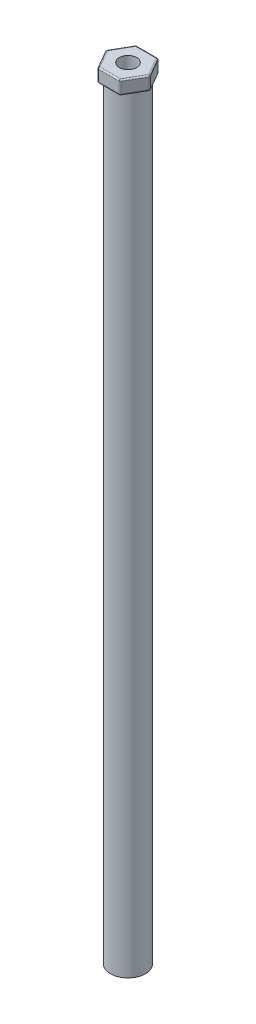
ISO-10303-21;
HEADER;
FILE_DESCRIPTION(('STEP AP214'),'2;1');
FILE_NAME('part.step','',(''),(''),'','','');
FILE_SCHEMA(('AUTOMOTIVE_DESIGN { 1 0 10303 214 1 1 1 1 }'));
ENDSEC;
DATA;
#1=APPLICATION_CONTEXT('core data for automotive mechanical design processes');
#2=APPLICATION_PROTOCOL_DEFINITION('international standard','automotive_design',2000,#1);
#3=PRODUCT_CONTEXT('',#1,'mechanical');
#4=PRODUCT('Part','Part','',(#3));
#5=PRODUCT_RELATED_PRODUCT_CATEGORY('part','',(#4));
#6=PRODUCT_DEFINITION_FORMATION('','',#4);
#7=PRODUCT_DEFINITION_CONTEXT('part definition',#1,'design');
#8=PRODUCT_DEFINITION('design','',#6,#7);
#9=PRODUCT_DEFINITION_SHAPE('','',#8);
#10=(LENGTH_UNIT() NAMED_UNIT(*) SI_UNIT(.MILLI.,.METRE.));
#11=(NAMED_UNIT(*) PLANE_ANGLE_UNIT() SI_UNIT($,.RADIAN.));
#12=(NAMED_UNIT(*) SI_UNIT($,.STERADIAN.) SOLID_ANGLE_UNIT());
#13=UNCERTAINTY_MEASURE_WITH_UNIT(LENGTH_MEASURE(1.E-05),#10,'distance_accuracy_value','');
#14=(GEOMETRIC_REPRESENTATION_CONTEXT(3) GLOBAL_UNCERTAINTY_ASSIGNED_CONTEXT((#13)) GLOBAL_UNIT_ASSIGNED_CONTEXT((#10,
#11,#12)) REPRESENTATION_CONTEXT('',''));
#15=CARTESIAN_POINT('',(0.,0.,0.));
#16=DIRECTION('',(0.,0.,1.));
#17=DIRECTION('',(1.,0.,0.));
#18=AXIS2_PLACEMENT_3D('',#15,#16,#17);
#19=CARTESIAN_POINT('',(0.,0.,0.));
#20=DIRECTION('',(0.,1.,0.));
#21=DIRECTION('',(0.,0.,1.));
#22=AXIS2_PLACEMENT_3D('',#19,#20,#21);
#23=PLANE('',#22);
#24=CARTESIAN_POINT('',(0.,0.,0.));
#25=DIRECTION('',(0.,1.,0.));
#26=DIRECTION('',(0.,0.,1.));
#27=AXIS2_PLACEMENT_3D('',#24,#25,#26);
#28=CIRCLE('',#27,6.35);
#29=CARTESIAN_POINT('',(0.,0.,6.35));
#30=VERTEX_POINT('',#29);
#31=EDGE_CURVE('E328',#30,#30,#28,.T.);
#32=ORIENTED_EDGE('',*,*,#31,.F.);
#33=EDGE_LOOP('',(#32));
#34=FACE_BOUND('',#33,.T.);
#35=CARTESIAN_POINT('',(0.,0.,0.));
#36=DIRECTION('',(0.,1.,0.));
#37=DIRECTION('',(0.,0.,1.));
#38=AXIS2_PLACEMENT_3D('',#35,#36,#37);
#39=CIRCLE('',#38,3.175);
#40=CARTESIAN_POINT('',(0.,0.,3.175));
#41=VERTEX_POINT('',#40);
#42=EDGE_CURVE('E322',#41,#41,#39,.T.);
#43=ORIENTED_EDGE('',*,*,#42,.T.);
#44=EDGE_LOOP('',(#43));
#45=FACE_BOUND('',#44,.T.);
#46=ADVANCED_FACE('F43',(#34,#45),#23,.F.);
#47=CARTESIAN_POINT('',(0.,279.4,0.));
#48=DIRECTION('',(0.,-1.,0.));
#49=DIRECTION('',(0.,0.,-1.));
#50=AXIS2_PLACEMENT_3D('',#47,#48,#49);
#51=CYLINDRICAL_SURFACE('',#50,6.35);
#52=CARTESIAN_POINT('',(0.,279.4,0.));
#53=DIRECTION('',(0.,1.,0.));
#54=DIRECTION('',(0.,0.,1.));
#55=AXIS2_PLACEMENT_3D('',#52,#53,#54);
#56=CIRCLE('',#55,6.35);
#57=CARTESIAN_POINT('',(0.,279.4,6.35));
#58=VERTEX_POINT('',#57);
#59=EDGE_CURVE('E192',#58,#58,#56,.T.);
#60=ORIENTED_EDGE('',*,*,#59,.F.);
#61=EDGE_LOOP('',(#60));
#62=FACE_BOUND('',#61,.T.);
#63=ORIENTED_EDGE('',*,*,#31,.T.);
#64=EDGE_LOOP('',(#63));
#65=FACE_BOUND('',#64,.T.);
#66=ADVANCED_FACE('F525',(#62,#65),#51,.T.);
#67=CARTESIAN_POINT('',(0.,279.4,0.));
#68=DIRECTION('',(0.,-1.,0.));
#69=DIRECTION('',(0.,0.,-1.));
#70=AXIS2_PLACEMENT_3D('',#67,#68,#69);
#71=CYLINDRICAL_SURFACE('',#70,3.175);
#72=ORIENTED_EDGE('',*,*,#42,.F.);
#73=EDGE_LOOP('',(#72));
#74=FACE_BOUND('',#73,.T.);
#75=CARTESIAN_POINT('',(0.,284.4,0.));
#76=DIRECTION('',(0.,1.,0.));
#77=DIRECTION('',(0.,0.,1.));
#78=AXIS2_PLACEMENT_3D('',#75,#76,#77);
#79=CIRCLE('',#78,3.175);
#80=CARTESIAN_POINT('',(0.,284.4,3.175));
#81=VERTEX_POINT('',#80);
#82=EDGE_CURVE('E315',#81,#81,#79,.T.);
#83=ORIENTED_EDGE('',*,*,#82,.T.);
#84=EDGE_LOOP('',(#83));
#85=FACE_BOUND('',#84,.T.);
#86=ADVANCED_FACE('F531',(#74,#85),#71,.F.);
#87=CARTESIAN_POINT('',(0.,284.4,0.));
#88=DIRECTION('',(0.,1.,0.));
#89=DIRECTION('',(0.,0.,1.));
#90=AXIS2_PLACEMENT_3D('',#87,#88,#89);
#91=PLANE('',#90);
#92=DIRECTION('',(1.,0.,0.));
#93=VECTOR('',#92,1.);
#94=CARTESIAN_POINT('',(4.03279163028954,284.4,6.485));
#95=LINE('',#94,#93);
#96=CARTESIAN_POINT('',(-3.74411649569472,284.4,6.485));
#97=VERTEX_POINT('',#96);
#98=CARTESIAN_POINT('',(3.74411649569473,284.4,6.485));
#99=VERTEX_POINT('',#98);
#100=EDGE_CURVE('E423',#97,#99,#95,.T.);
#101=ORIENTED_EDGE('',*,*,#100,.T.);
#102=DIRECTION('',(0.5,0.,-0.866025403784439));
#103=VECTOR('',#102,1.);
#104=CARTESIAN_POINT('',(7.63257055868686,284.4,-0.250000000000001));
#105=LINE('',#104,#103);
#106=CARTESIAN_POINT('',(7.48823299138945,284.4,0.));
#107=VERTEX_POINT('',#106);
#108=EDGE_CURVE('E11',#99,#107,#105,.T.);
#109=ORIENTED_EDGE('',*,*,#108,.T.);
#110=DIRECTION('',(-0.5,0.,-0.866025403784439));
#111=VECTOR('',#110,1.);
#112=CARTESIAN_POINT('',(3.59977892839731,284.4,-6.73500000000001));
#113=LINE('',#112,#111);
#114=CARTESIAN_POINT('',(3.74411649569472,284.4,-6.485));
#115=VERTEX_POINT('',#114);
#116=EDGE_CURVE('E53',#107,#115,#113,.T.);
#117=ORIENTED_EDGE('',*,*,#116,.T.);
#118=DIRECTION('',(-1.,0.,0.));
#119=VECTOR('',#118,1.);
#120=CARTESIAN_POINT('',(-4.03279163028953,284.4,-6.485));
#121=LINE('',#120,#119);
#122=CARTESIAN_POINT('',(-3.74411649569472,284.4,-6.485));
#123=VERTEX_POINT('',#122);
#124=EDGE_CURVE('E432',#115,#123,#121,.T.);
#125=ORIENTED_EDGE('',*,*,#124,.T.);
#126=DIRECTION('',(-0.5,0.,0.866025403784439));
#127=VECTOR('',#126,1.);
#128=CARTESIAN_POINT('',(-7.63257055868686,284.4,0.250000000000005));
#129=LINE('',#128,#127);
#130=CARTESIAN_POINT('',(-7.48823299138945,284.4,0.));
#131=VERTEX_POINT('',#130);
#132=EDGE_CURVE('E429',#123,#131,#129,.T.);
#133=ORIENTED_EDGE('',*,*,#132,.T.);
#134=DIRECTION('',(0.5,0.,0.866025403784438));
#135=VECTOR('',#134,1.);
#136=CARTESIAN_POINT('',(-3.59977892839732,284.4,6.735));
#137=LINE('',#136,#135);
#138=EDGE_CURVE('E426',#131,#97,#137,.T.);
#139=ORIENTED_EDGE('',*,*,#138,.T.);
#140=EDGE_LOOP('',(#101,#109,#117,#125,#133,#139));
#141=FACE_BOUND('',#140,.T.);
#142=ORIENTED_EDGE('',*,*,#82,.F.);
#143=EDGE_LOOP('',(#142));
#144=FACE_BOUND('',#143,.T.);
#145=ADVANCED_FACE('F490',(#141,#144),#91,.T.);
#146=CARTESIAN_POINT('',(0.,279.4,0.));
#147=DIRECTION('',(0.,1.,0.));
#148=DIRECTION('',(0.,0.,1.));
#149=AXIS2_PLACEMENT_3D('',#146,#147,#148);
#150=PLANE('',#149);
#151=DIRECTION('',(-0.5,0.,0.866025403784439));
#152=VECTOR('',#151,1.);
#153=CARTESIAN_POINT('',(-5.61617474354209,279.4,-3.2425));
#154=LINE('',#153,#152);
#155=CARTESIAN_POINT('',(-7.48823299138945,279.4,0.));
#156=VERTEX_POINT('',#155);
#157=CARTESIAN_POINT('',(-3.74411649569472,279.4,-6.485));
#158=VERTEX_POINT('',#157);
#159=EDGE_CURVE('E350',#156,#158,#154,.F.);
#160=ORIENTED_EDGE('',*,*,#159,.T.);
#161=DIRECTION('',(-1.,0.,0.));
#162=VECTOR('',#161,1.);
#163=CARTESIAN_POINT('',(0.,279.4,-6.485));
#164=LINE('',#163,#162);
#165=CARTESIAN_POINT('',(3.74411649569472,279.4,-6.485));
#166=VERTEX_POINT('',#165);
#167=EDGE_CURVE('E356',#158,#166,#164,.F.);
#168=ORIENTED_EDGE('',*,*,#167,.T.);
#169=DIRECTION('',(-0.5,0.,-0.866025403784439));
#170=VECTOR('',#169,1.);
#171=CARTESIAN_POINT('',(5.61617474354209,279.4,-3.2425));
#172=LINE('',#171,#170);
#173=CARTESIAN_POINT('',(7.48823299138945,279.4,0.));
#174=VERTEX_POINT('',#173);
#175=EDGE_CURVE('E353',#166,#174,#172,.F.);
#176=ORIENTED_EDGE('',*,*,#175,.T.);
#177=DIRECTION('',(0.5,0.,-0.866025403784439));
#178=VECTOR('',#177,1.);
#179=CARTESIAN_POINT('',(5.61617474354209,279.4,3.2425));
#180=LINE('',#179,#178);
#181=CARTESIAN_POINT('',(3.74411649569472,279.4,6.485));
#182=VERTEX_POINT('',#181);
#183=EDGE_CURVE('E341',#174,#182,#180,.F.);
#184=ORIENTED_EDGE('',*,*,#183,.T.);
#185=DIRECTION('',(1.,0.,0.));
#186=VECTOR('',#185,1.);
#187=CARTESIAN_POINT('',(0.,279.4,6.485));
#188=LINE('',#187,#186);
#189=CARTESIAN_POINT('',(-3.74411649569472,279.4,6.485));
#190=VERTEX_POINT('',#189);
#191=EDGE_CURVE('E344',#182,#190,#188,.F.);
#192=ORIENTED_EDGE('',*,*,#191,.T.);
#193=DIRECTION('',(0.5,0.,0.866025403784438));
#194=VECTOR('',#193,1.);
#195=CARTESIAN_POINT('',(-5.61617474354208,279.4,3.2425));
#196=LINE('',#195,#194);
#197=EDGE_CURVE('E347',#190,#156,#196,.F.);
#198=ORIENTED_EDGE('',*,*,#197,.T.);
#199=EDGE_LOOP('',(#160,#168,#176,#184,#192,#198));
#200=FACE_BOUND('',#199,.T.);
#201=ORIENTED_EDGE('',*,*,#59,.T.);
#202=EDGE_LOOP('',(#201));
#203=FACE_BOUND('',#202,.T.);
#204=ADVANCED_FACE('F468',(#200,#203),#150,.F.);
#205=CARTESIAN_POINT('',(-4.03279163028953,284.4,-6.985));
#206=DIRECTION('',(0.866025403784439,0.,0.5));
#207=DIRECTION('',(0.5,0.,-0.866025403784439));
#208=AXIS2_PLACEMENT_3D('',#205,#206,#207);
#209=PLANE('',#208);
#210=DIRECTION('',(-0.5,0.,0.866025403784439));
#211=VECTOR('',#210,1.);
#212=CARTESIAN_POINT('',(-4.03279163028953,283.9,-6.985));
#213=LINE('',#212,#211);
#214=CARTESIAN_POINT('',(-7.92124569328167,283.9,-0.249999999999997));
#215=VERTEX_POINT('',#214);
#216=CARTESIAN_POINT('',(-4.17712919758694,283.9,-6.735));
#217=VERTEX_POINT('',#216);
#218=EDGE_CURVE('E386',#215,#217,#213,.F.);
#219=ORIENTED_EDGE('',*,*,#218,.T.);
#220=DIRECTION('',(0.,-1.,0.));
#221=VECTOR('',#220,1.);
#222=CARTESIAN_POINT('',(-4.17712919758694,284.4,-6.735));
#223=LINE('',#222,#221);
#224=CARTESIAN_POINT('',(-4.17712919758694,279.9,-6.735));
#225=VERTEX_POINT('',#224);
#226=EDGE_CURVE('E205',#217,#225,#223,.T.);
#227=ORIENTED_EDGE('',*,*,#226,.T.);
#228=DIRECTION('',(-0.5,0.,0.866025403784439));
#229=VECTOR('',#228,1.);
#230=CARTESIAN_POINT('',(-4.03279163028953,279.9,-6.985));
#231=LINE('',#230,#229);
#232=CARTESIAN_POINT('',(-7.92124569328167,279.9,-0.249999999999997));
#233=VERTEX_POINT('',#232);
#234=EDGE_CURVE('E392',#225,#233,#231,.T.);
#235=ORIENTED_EDGE('',*,*,#234,.T.);
#236=DIRECTION('',(0.,-1.,0.));
#237=VECTOR('',#236,1.);
#238=CARTESIAN_POINT('',(-7.92124569328167,284.4,-0.249999999999998));
#239=LINE('',#238,#237);
#240=EDGE_CURVE('E389',#233,#215,#239,.F.);
#241=ORIENTED_EDGE('',*,*,#240,.T.);
#242=EDGE_LOOP('',(#219,#227,#235,#241));
#243=FACE_BOUND('',#242,.T.);
#244=ADVANCED_FACE('F483',(#243),#209,.F.);
#245=CARTESIAN_POINT('',(-8.06558326057907,284.4,0.));
#246=DIRECTION('',(0.866025403784438,0.,-0.5));
#247=DIRECTION('',(-0.5,0.,-0.866025403784438));
#248=AXIS2_PLACEMENT_3D('',#245,#246,#247);
#249=PLANE('',#248);
#250=DIRECTION('',(0.5,0.,0.866025403784438));
#251=VECTOR('',#250,1.);
#252=CARTESIAN_POINT('',(-8.06558326057907,283.9,0.));
#253=LINE('',#252,#251);
#254=CARTESIAN_POINT('',(-4.17712919758694,283.9,6.735));
#255=VERTEX_POINT('',#254);
#256=CARTESIAN_POINT('',(-7.92124569328167,283.9,0.250000000000003));
#257=VERTEX_POINT('',#256);
#258=EDGE_CURVE('E397',#255,#257,#253,.F.);
#259=ORIENTED_EDGE('',*,*,#258,.T.);
#260=DIRECTION('',(0.,-1.,0.));
#261=VECTOR('',#260,1.);
#262=CARTESIAN_POINT('',(-7.92124569328167,284.4,0.250000000000003));
#263=LINE('',#262,#261);
#264=CARTESIAN_POINT('',(-7.92124569328167,279.9,0.250000000000003));
#265=VERTEX_POINT('',#264);
#266=EDGE_CURVE('E406',#257,#265,#263,.T.);
#267=ORIENTED_EDGE('',*,*,#266,.T.);
#268=DIRECTION('',(0.5,0.,0.866025403784438));
#269=VECTOR('',#268,1.);
#270=CARTESIAN_POINT('',(-8.06558326057907,279.9,0.));
#271=LINE('',#270,#269);
#272=CARTESIAN_POINT('',(-4.17712919758694,279.9,6.735));
#273=VERTEX_POINT('',#272);
#274=EDGE_CURVE('E403',#265,#273,#271,.T.);
#275=ORIENTED_EDGE('',*,*,#274,.T.);
#276=DIRECTION('',(0.,-1.,0.));
#277=VECTOR('',#276,1.);
#278=CARTESIAN_POINT('',(-4.17712919758694,284.4,6.735));
#279=LINE('',#278,#277);
#280=EDGE_CURVE('E400',#273,#255,#279,.F.);
#281=ORIENTED_EDGE('',*,*,#280,.T.);
#282=EDGE_LOOP('',(#259,#267,#275,#281));
#283=FACE_BOUND('',#282,.T.);
#284=ADVANCED_FACE('F506',(#283),#249,.F.);
#285=CARTESIAN_POINT('',(-4.03279163028953,284.4,6.985));
#286=DIRECTION('',(0.,0.,-1.));
#287=DIRECTION('',(-1.,0.,0.));
#288=AXIS2_PLACEMENT_3D('',#285,#286,#287);
#289=PLANE('',#288);
#290=DIRECTION('',(1.,0.,0.));
#291=VECTOR('',#290,1.);
#292=CARTESIAN_POINT('',(-4.03279163028953,283.9,6.985));
#293=LINE('',#292,#291);
#294=CARTESIAN_POINT('',(3.74411649569472,283.9,6.985));
#295=VERTEX_POINT('',#294);
#296=CARTESIAN_POINT('',(-3.74411649569472,283.9,6.985));
#297=VERTEX_POINT('',#296);
#298=EDGE_CURVE('E410',#295,#297,#293,.F.);
#299=ORIENTED_EDGE('',*,*,#298,.T.);
#300=DIRECTION('',(0.,-1.,0.));
#301=VECTOR('',#300,1.);
#302=CARTESIAN_POINT('',(-3.74411649569472,284.4,6.985));
#303=LINE('',#302,#301);
#304=CARTESIAN_POINT('',(-3.74411649569472,279.9,6.985));
#305=VERTEX_POINT('',#304);
#306=EDGE_CURVE('E419',#297,#305,#303,.T.);
#307=ORIENTED_EDGE('',*,*,#306,.T.);
#308=DIRECTION('',(1.,0.,0.));
#309=VECTOR('',#308,1.);
#310=CARTESIAN_POINT('',(-4.03279163028953,279.9,6.985));
#311=LINE('',#310,#309);
#312=CARTESIAN_POINT('',(3.74411649569472,279.9,6.985));
#313=VERTEX_POINT('',#312);
#314=EDGE_CURVE('E416',#305,#313,#311,.T.);
#315=ORIENTED_EDGE('',*,*,#314,.T.);
#316=DIRECTION('',(0.,-1.,0.));
#317=VECTOR('',#316,1.);
#318=CARTESIAN_POINT('',(3.74411649569472,284.4,6.985));
#319=LINE('',#318,#317);
#320=EDGE_CURVE('E413',#313,#295,#319,.F.);
#321=ORIENTED_EDGE('',*,*,#320,.T.);
#322=EDGE_LOOP('',(#299,#307,#315,#321));
#323=FACE_BOUND('',#322,.T.);
#324=ADVANCED_FACE('F637',(#323),#289,.F.);
#325=CARTESIAN_POINT('',(4.03279163028954,284.4,6.985));
#326=DIRECTION('',(-0.866025403784439,0.,-0.5));
#327=DIRECTION('',(-0.5,0.,0.866025403784439));
#328=AXIS2_PLACEMENT_3D('',#325,#326,#327);
#329=PLANE('',#328);
#330=DIRECTION('',(0.5,0.,-0.866025403784439));
#331=VECTOR('',#330,1.);
#332=CARTESIAN_POINT('',(4.03279163028954,279.9,6.985));
#333=LINE('',#332,#331);
#334=CARTESIAN_POINT('',(4.17712919758694,279.9,6.735));
#335=VERTEX_POINT('',#334);
#336=CARTESIAN_POINT('',(7.92124569328167,279.9,0.25));
#337=VERTEX_POINT('',#336);
#338=EDGE_CURVE('E379',#335,#337,#333,.T.);
#339=ORIENTED_EDGE('',*,*,#338,.T.);
#340=DIRECTION('',(0.,-1.,0.));
#341=VECTOR('',#340,1.);
#342=CARTESIAN_POINT('',(7.92124569328167,284.4,0.249999999999999));
#343=LINE('',#342,#341);
#344=CARTESIAN_POINT('',(7.92124569328167,283.9,0.25));
#345=VERTEX_POINT('',#344);
#346=EDGE_CURVE('E382',#337,#345,#343,.F.);
#347=ORIENTED_EDGE('',*,*,#346,.T.);
#348=DIRECTION('',(0.5,0.,-0.866025403784439));
#349=VECTOR('',#348,1.);
#350=CARTESIAN_POINT('',(4.03279163028954,283.9,6.985));
#351=LINE('',#350,#349);
#352=CARTESIAN_POINT('',(4.17712919758694,283.9,6.735));
#353=VERTEX_POINT('',#352);
#354=EDGE_CURVE('E373',#345,#353,#351,.F.);
#355=ORIENTED_EDGE('',*,*,#354,.T.);
#356=DIRECTION('',(0.,-1.,0.));
#357=VECTOR('',#356,1.);
#358=CARTESIAN_POINT('',(4.17712919758694,284.4,6.735));
#359=LINE('',#358,#357);
#360=EDGE_CURVE('E376',#353,#335,#359,.T.);
#361=ORIENTED_EDGE('',*,*,#360,.T.);
#362=EDGE_LOOP('',(#339,#347,#355,#361));
#363=FACE_BOUND('',#362,.T.);
#364=ADVANCED_FACE('F624',(#363),#329,.F.);
#365=CARTESIAN_POINT('',(8.06558326057907,284.4,0.));
#366=DIRECTION('',(-0.866025403784439,0.,0.5));
#367=DIRECTION('',(0.5,0.,0.866025403784439));
#368=AXIS2_PLACEMENT_3D('',#365,#366,#367);
#369=PLANE('',#368);
#370=DIRECTION('',(0.,-1.,0.));
#371=VECTOR('',#370,1.);
#372=CARTESIAN_POINT('',(7.92124569328167,284.4,-0.250000000000001));
#373=LINE('',#372,#371);
#374=CARTESIAN_POINT('',(7.92124569328167,283.9,-0.250000000000001));
#375=VERTEX_POINT('',#374);
#376=CARTESIAN_POINT('',(7.92124569328167,279.9,-0.250000000000001));
#377=VERTEX_POINT('',#376);
#378=EDGE_CURVE('E363',#375,#377,#373,.T.);
#379=ORIENTED_EDGE('',*,*,#378,.T.);
#380=DIRECTION('',(-0.5,0.,-0.866025403784439));
#381=VECTOR('',#380,1.);
#382=CARTESIAN_POINT('',(8.06558326057907,279.9,0.));
#383=LINE('',#382,#381);
#384=CARTESIAN_POINT('',(4.17712919758694,279.9,-6.735));
#385=VERTEX_POINT('',#384);
#386=EDGE_CURVE('E369',#377,#385,#383,.T.);
#387=ORIENTED_EDGE('',*,*,#386,.T.);
#388=DIRECTION('',(0.,-1.,0.));
#389=VECTOR('',#388,1.);
#390=CARTESIAN_POINT('',(4.17712919758694,284.4,-6.735));
#391=LINE('',#390,#389);
#392=CARTESIAN_POINT('',(4.17712919758694,283.9,-6.735));
#393=VERTEX_POINT('',#392);
#394=EDGE_CURVE('E366',#385,#393,#391,.F.);
#395=ORIENTED_EDGE('',*,*,#394,.T.);
#396=DIRECTION('',(-0.5,0.,-0.866025403784439));
#397=VECTOR('',#396,1.);
#398=CARTESIAN_POINT('',(8.06558326057907,283.9,0.));
#399=LINE('',#398,#397);
#400=EDGE_CURVE('E360',#393,#375,#399,.F.);
#401=ORIENTED_EDGE('',*,*,#400,.T.);
#402=EDGE_LOOP('',(#379,#387,#395,#401));
#403=FACE_BOUND('',#402,.T.);
#404=ADVANCED_FACE('F632',(#403),#369,.F.);
#405=CARTESIAN_POINT('',(4.03279163028953,284.4,-6.985));
#406=DIRECTION('',(0.,0.,1.));
#407=DIRECTION('',(1.,0.,0.));
#408=AXIS2_PLACEMENT_3D('',#405,#406,#407);
#409=PLANE('',#408);
#410=DIRECTION('',(0.,-1.,0.));
#411=VECTOR('',#410,1.);
#412=CARTESIAN_POINT('',(3.74411649569472,284.4,-6.985));
#413=LINE('',#412,#411);
#414=CARTESIAN_POINT('',(3.74411649569472,283.9,-6.985));
#415=VERTEX_POINT('',#414);
#416=CARTESIAN_POINT('',(3.74411649569472,279.9,-6.985));
#417=VERTEX_POINT('',#416);
#418=EDGE_CURVE('E180',#415,#417,#413,.T.);
#419=ORIENTED_EDGE('',*,*,#418,.T.);
#420=DIRECTION('',(-1.,0.,0.));
#421=VECTOR('',#420,1.);
#422=CARTESIAN_POINT('',(4.03279163028953,279.9,-6.985));
#423=LINE('',#422,#421);
#424=CARTESIAN_POINT('',(-3.74411649569472,279.9,-6.985));
#425=VERTEX_POINT('',#424);
#426=EDGE_CURVE('E175',#417,#425,#423,.T.);
#427=ORIENTED_EDGE('',*,*,#426,.T.);
#428=DIRECTION('',(0.,-1.,0.));
#429=VECTOR('',#428,1.);
#430=CARTESIAN_POINT('',(-3.74411649569472,284.4,-6.985));
#431=LINE('',#430,#429);
#432=CARTESIAN_POINT('',(-3.74411649569472,283.9,-6.985));
#433=VERTEX_POINT('',#432);
#434=EDGE_CURVE('E169',#425,#433,#431,.F.);
#435=ORIENTED_EDGE('',*,*,#434,.T.);
#436=DIRECTION('',(-1.,0.,0.));
#437=VECTOR('',#436,1.);
#438=CARTESIAN_POINT('',(4.03279163028953,283.9,-6.985));
#439=LINE('',#438,#437);
#440=EDGE_CURVE('E172',#433,#415,#439,.F.);
#441=ORIENTED_EDGE('',*,*,#440,.T.);
#442=EDGE_LOOP('',(#419,#427,#435,#441));
#443=FACE_BOUND('',#442,.T.);
#444=ADVANCED_FACE('F171',(#443),#409,.F.);
#445=CARTESIAN_POINT('',(0.,283.9,6.485));
#446=DIRECTION('',(-1.,0.,0.));
#447=DIRECTION('',(0.,0.,1.));
#448=AXIS2_PLACEMENT_3D('',#445,#446,#447);
#449=CYLINDRICAL_SURFACE('',#448,0.5);
#450=CARTESIAN_POINT('',(3.74411649569473,283.9,6.485));
#451=DIRECTION('',(1.,0.,0.));
#452=DIRECTION('',(0.,0.,-1.));
#453=AXIS2_PLACEMENT_3D('',#450,#451,#452);
#454=CIRCLE('',#453,0.5);
#455=EDGE_CURVE('E47',#99,#295,#454,.T.);
#456=ORIENTED_EDGE('',*,*,#455,.F.);
#457=ORIENTED_EDGE('',*,*,#100,.F.);
#458=CARTESIAN_POINT('',(-3.74411649569472,283.9,6.485));
#459=DIRECTION('',(-1.,0.,0.));
#460=DIRECTION('',(0.,-1.,0.));
#461=AXIS2_PLACEMENT_3D('',#458,#459,#460);
#462=CIRCLE('',#461,0.5);
#463=EDGE_CURVE('E306',#297,#97,#462,.T.);
#464=ORIENTED_EDGE('',*,*,#463,.F.);
#465=ORIENTED_EDGE('',*,*,#298,.F.);
#466=EDGE_LOOP('',(#456,#457,#464,#465));
#467=FACE_BOUND('',#466,.T.);
#468=ADVANCED_FACE('F45',(#467),#449,.T.);
#469=CARTESIAN_POINT('',(3.74411649569472,283.9,6.485));
#470=DIRECTION('',(0.,1.,0.));
#471=DIRECTION('',(-1.,0.,0.));
#472=AXIS2_PLACEMENT_3D('',#469,#470,#471);
#473=SPHERICAL_SURFACE('',#472,0.5);
#474=CARTESIAN_POINT('',(3.74411649569472,283.9,6.485));
#475=DIRECTION('',(-0.500000000000001,0.,0.866025403784438));
#476=DIRECTION('',(0.866025403784438,0.,0.500000000000001));
#477=AXIS2_PLACEMENT_3D('',#474,#475,#476);
#478=CIRCLE('',#477,0.5);
#479=EDGE_CURVE('E299',#99,#353,#478,.F.);
#480=ORIENTED_EDGE('',*,*,#479,.F.);
#481=ORIENTED_EDGE('',*,*,#455,.T.);
#482=CARTESIAN_POINT('',(3.74411649569472,283.9,6.485));
#483=DIRECTION('',(0.,1.,0.));
#484=DIRECTION('',(0.,0.,1.));
#485=AXIS2_PLACEMENT_3D('',#482,#483,#484);
#486=CIRCLE('',#485,0.5);
#487=EDGE_CURVE('E303',#353,#295,#486,.F.);
#488=ORIENTED_EDGE('',*,*,#487,.F.);
#489=EDGE_LOOP('',(#480,#481,#488));
#490=FACE_BOUND('',#489,.T.);
#491=ADVANCED_FACE('F515',(#490),#473,.T.);
#492=CARTESIAN_POINT('',(-3.74411649569472,283.9,6.485));
#493=DIRECTION('',(0.,1.,0.));
#494=DIRECTION('',(-1.,0.,0.));
#495=AXIS2_PLACEMENT_3D('',#492,#493,#494);
#496=SPHERICAL_SURFACE('',#495,0.5);
#497=CARTESIAN_POINT('',(-3.74411649569472,283.9,6.485));
#498=DIRECTION('',(0.,1.,0.));
#499=DIRECTION('',(0.,0.,1.));
#500=AXIS2_PLACEMENT_3D('',#497,#498,#499);
#501=CIRCLE('',#500,0.5);
#502=EDGE_CURVE('E291',#297,#255,#501,.F.);
#503=ORIENTED_EDGE('',*,*,#502,.F.);
#504=ORIENTED_EDGE('',*,*,#463,.T.);
#505=CARTESIAN_POINT('',(-3.74411649569472,283.9,6.485));
#506=DIRECTION('',(0.5,0.,0.866025403784439));
#507=DIRECTION('',(0.866025403784439,0.,-0.5));
#508=AXIS2_PLACEMENT_3D('',#505,#506,#507);
#509=CIRCLE('',#508,0.5);
#510=EDGE_CURVE('E295',#255,#97,#509,.F.);
#511=ORIENTED_EDGE('',*,*,#510,.F.);
#512=EDGE_LOOP('',(#503,#504,#511));
#513=FACE_BOUND('',#512,.T.);
#514=ADVANCED_FACE('F512',(#513),#496,.T.);
#515=CARTESIAN_POINT('',(3.74411649569472,284.4,6.485));
#516=DIRECTION('',(0.,-1.,0.));
#517=DIRECTION('',(0.,0.,-1.));
#518=AXIS2_PLACEMENT_3D('',#515,#516,#517);
#519=CYLINDRICAL_SURFACE('',#518,0.5);
#520=ORIENTED_EDGE('',*,*,#487,.T.);
#521=ORIENTED_EDGE('',*,*,#320,.F.);
#522=CARTESIAN_POINT('',(3.74411649569472,279.9,6.485));
#523=DIRECTION('',(0.,-1.,0.));
#524=DIRECTION('',(0.,0.,-1.));
#525=AXIS2_PLACEMENT_3D('',#522,#523,#524);
#526=CIRCLE('',#525,0.5);
#527=EDGE_CURVE('E283',#335,#313,#526,.T.);
#528=ORIENTED_EDGE('',*,*,#527,.F.);
#529=ORIENTED_EDGE('',*,*,#360,.F.);
#530=EDGE_LOOP('',(#520,#521,#528,#529));
#531=FACE_BOUND('',#530,.T.);
#532=ADVANCED_FACE('F514',(#531),#519,.T.);
#533=CARTESIAN_POINT('',(5.61617474354209,283.9,3.2425));
#534=DIRECTION('',(-0.5,0.,0.866025403784439));
#535=DIRECTION('',(0.866025403784439,0.,0.5));
#536=AXIS2_PLACEMENT_3D('',#533,#534,#535);
#537=CYLINDRICAL_SURFACE('',#536,0.5);
#538=ORIENTED_EDGE('',*,*,#479,.T.);
#539=ORIENTED_EDGE('',*,*,#354,.F.);
#540=CARTESIAN_POINT('',(7.48823299138945,283.9,0.));
#541=DIRECTION('',(0.499999999999999,0.,-0.866025403784439));
#542=DIRECTION('',(-0.866025403784439,0.,-0.499999999999999));
#543=AXIS2_PLACEMENT_3D('',#540,#541,#542);
#544=CIRCLE('',#543,0.5);
#545=EDGE_CURVE('E279',#107,#345,#544,.T.);
#546=ORIENTED_EDGE('',*,*,#545,.F.);
#547=ORIENTED_EDGE('',*,*,#108,.F.);
#548=EDGE_LOOP('',(#538,#539,#546,#547));
#549=FACE_BOUND('',#548,.T.);
#550=ADVANCED_FACE('F521',(#549),#537,.T.);
#551=CARTESIAN_POINT('',(-5.61617474354208,283.9,3.2425));
#552=DIRECTION('',(-0.5,0.,-0.866025403784438));
#553=DIRECTION('',(-0.866025403784438,0.,0.5));
#554=AXIS2_PLACEMENT_3D('',#551,#552,#553);
#555=CYLINDRICAL_SURFACE('',#554,0.5);
#556=ORIENTED_EDGE('',*,*,#510,.T.);
#557=ORIENTED_EDGE('',*,*,#138,.F.);
#558=CARTESIAN_POINT('',(-7.48823299138945,283.9,0.));
#559=DIRECTION('',(-0.5,0.,-0.866025403784439));
#560=DIRECTION('',(-0.866025403784439,0.,0.5));
#561=AXIS2_PLACEMENT_3D('',#558,#559,#560);
#562=CIRCLE('',#561,0.5);
#563=EDGE_CURVE('E275',#257,#131,#562,.T.);
#564=ORIENTED_EDGE('',*,*,#563,.F.);
#565=ORIENTED_EDGE('',*,*,#258,.F.);
#566=EDGE_LOOP('',(#556,#557,#564,#565));
#567=FACE_BOUND('',#566,.T.);
#568=ADVANCED_FACE('F495',(#567),#555,.T.);
#569=CARTESIAN_POINT('',(-3.74411649569472,284.4,6.485));
#570=DIRECTION('',(0.,-1.,0.));
#571=DIRECTION('',(0.,0.,-1.));
#572=AXIS2_PLACEMENT_3D('',#569,#570,#571);
#573=CYLINDRICAL_SURFACE('',#572,0.5);
#574=ORIENTED_EDGE('',*,*,#502,.T.);
#575=ORIENTED_EDGE('',*,*,#280,.F.);
#576=CARTESIAN_POINT('',(-3.74411649569472,279.9,6.485));
#577=DIRECTION('',(0.,-1.,0.));
#578=DIRECTION('',(0.,0.,-1.));
#579=AXIS2_PLACEMENT_3D('',#576,#577,#578);
#580=CIRCLE('',#579,0.5);
#581=EDGE_CURVE('E271',#305,#273,#580,.T.);
#582=ORIENTED_EDGE('',*,*,#581,.F.);
#583=ORIENTED_EDGE('',*,*,#306,.F.);
#584=EDGE_LOOP('',(#574,#575,#582,#583));
#585=FACE_BOUND('',#584,.T.);
#586=ADVANCED_FACE('F511',(#585),#573,.T.);
#587=CARTESIAN_POINT('',(-4.03279163028953,279.9,6.485));
#588=DIRECTION('',(1.,0.,0.));
#589=DIRECTION('',(0.,0.,-1.));
#590=AXIS2_PLACEMENT_3D('',#587,#588,#589);
#591=CYLINDRICAL_SURFACE('',#590,0.5);
#592=CARTESIAN_POINT('',(3.74411649569472,279.9,6.485));
#593=DIRECTION('',(1.,0.,0.));
#594=DIRECTION('',(0.,0.,-1.));
#595=AXIS2_PLACEMENT_3D('',#592,#593,#594);
#596=CIRCLE('',#595,0.5);
#597=EDGE_CURVE('E287',#313,#182,#596,.T.);
#598=ORIENTED_EDGE('',*,*,#597,.F.);
#599=ORIENTED_EDGE('',*,*,#314,.F.);
#600=CARTESIAN_POINT('',(-3.74411649569472,279.9,6.485));
#601=DIRECTION('',(-1.,0.,0.));
#602=DIRECTION('',(0.,0.,1.));
#603=AXIS2_PLACEMENT_3D('',#600,#601,#602);
#604=CIRCLE('',#603,0.5);
#605=EDGE_CURVE('E268',#190,#305,#604,.T.);
#606=ORIENTED_EDGE('',*,*,#605,.F.);
#607=ORIENTED_EDGE('',*,*,#191,.F.);
#608=EDGE_LOOP('',(#598,#599,#606,#607));
#609=FACE_BOUND('',#608,.T.);
#610=ADVANCED_FACE('F603',(#609),#591,.T.);
#611=CARTESIAN_POINT('',(3.74411649569472,279.9,6.485));
#612=DIRECTION('',(0.,-1.,0.));
#613=DIRECTION('',(0.,0.,-1.));
#614=AXIS2_PLACEMENT_3D('',#611,#612,#613);
#615=SPHERICAL_SURFACE('',#614,0.5);
#616=ORIENTED_EDGE('',*,*,#527,.T.);
#617=ORIENTED_EDGE('',*,*,#597,.T.);
#618=CARTESIAN_POINT('',(3.74411649569472,279.9,6.485));
#619=DIRECTION('',(-0.500000000000001,0.,0.866025403784438));
#620=DIRECTION('',(0.866025403784438,0.,0.500000000000001));
#621=AXIS2_PLACEMENT_3D('',#618,#619,#620);
#622=CIRCLE('',#621,0.5);
#623=EDGE_CURVE('E264',#335,#182,#622,.F.);
#624=ORIENTED_EDGE('',*,*,#623,.F.);
#625=EDGE_LOOP('',(#616,#617,#624));
#626=FACE_BOUND('',#625,.T.);
#627=ADVANCED_FACE('F599',(#626),#615,.T.);
#628=CARTESIAN_POINT('',(7.48823299138945,283.9,0.));
#629=DIRECTION('',(0.,1.,0.));
#630=DIRECTION('',(0.,0.,1.));
#631=AXIS2_PLACEMENT_3D('',#628,#629,#630);
#632=SPHERICAL_SURFACE('',#631,0.5);
#633=CARTESIAN_POINT('',(7.48823299138945,283.9,0.));
#634=DIRECTION('',(0.5,0.,0.866025403784439));
#635=DIRECTION('',(0.866025403784439,0.,-0.5));
#636=AXIS2_PLACEMENT_3D('',#633,#634,#635);
#637=CIRCLE('',#636,0.5);
#638=EDGE_CURVE('E258',#107,#375,#637,.F.);
#639=ORIENTED_EDGE('',*,*,#638,.F.);
#640=ORIENTED_EDGE('',*,*,#545,.T.);
#641=CARTESIAN_POINT('',(7.48823299138945,283.9,0.));
#642=DIRECTION('',(0.,1.,0.));
#643=DIRECTION('',(0.,0.,1.));
#644=AXIS2_PLACEMENT_3D('',#641,#642,#643);
#645=CIRCLE('',#644,0.5);
#646=EDGE_CURVE('E261',#375,#345,#645,.F.);
#647=ORIENTED_EDGE('',*,*,#646,.F.);
#648=EDGE_LOOP('',(#639,#640,#647));
#649=FACE_BOUND('',#648,.T.);
#650=ADVANCED_FACE('F596',(#649),#632,.T.);
#651=CARTESIAN_POINT('',(-7.48823299138945,283.9,0.));
#652=DIRECTION('',(0.,1.,0.));
#653=DIRECTION('',(-1.,0.,0.));
#654=AXIS2_PLACEMENT_3D('',#651,#652,#653);
#655=SPHERICAL_SURFACE('',#654,0.5);
#656=CARTESIAN_POINT('',(-7.48823299138945,283.9,0.));
#657=DIRECTION('',(0.,1.,0.));
#658=DIRECTION('',(0.,0.,1.));
#659=AXIS2_PLACEMENT_3D('',#656,#657,#658);
#660=CIRCLE('',#659,0.5);
#661=EDGE_CURVE('E250',#257,#215,#660,.F.);
#662=ORIENTED_EDGE('',*,*,#661,.F.);
#663=ORIENTED_EDGE('',*,*,#563,.T.);
#664=CARTESIAN_POINT('',(-7.48823299138945,283.9,0.));
#665=DIRECTION('',(-0.499999999999998,0.,0.86602540378444));
#666=DIRECTION('',(0.86602540378444,0.,0.499999999999998));
#667=AXIS2_PLACEMENT_3D('',#664,#665,#666);
#668=CIRCLE('',#667,0.5);
#669=EDGE_CURVE('E254',#215,#131,#668,.F.);
#670=ORIENTED_EDGE('',*,*,#669,.F.);
#671=EDGE_LOOP('',(#662,#663,#670));
#672=FACE_BOUND('',#671,.T.);
#673=ADVANCED_FACE('F499',(#672),#655,.T.);
#674=CARTESIAN_POINT('',(-3.74411649569472,279.9,6.485));
#675=DIRECTION('',(0.,-1.,0.));
#676=DIRECTION('',(0.,0.,-1.));
#677=AXIS2_PLACEMENT_3D('',#674,#675,#676);
#678=SPHERICAL_SURFACE('',#677,0.5);
#679=ORIENTED_EDGE('',*,*,#605,.T.);
#680=ORIENTED_EDGE('',*,*,#581,.T.);
#681=CARTESIAN_POINT('',(-3.74411649569472,279.9,6.485));
#682=DIRECTION('',(0.500000000000001,0.,0.866025403784438));
#683=DIRECTION('',(0.866025403784438,0.,-0.500000000000001));
#684=AXIS2_PLACEMENT_3D('',#681,#682,#683);
#685=CIRCLE('',#684,0.5);
#686=EDGE_CURVE('E246',#190,#273,#685,.F.);
#687=ORIENTED_EDGE('',*,*,#686,.F.);
#688=EDGE_LOOP('',(#679,#680,#687));
#689=FACE_BOUND('',#688,.T.);
#690=ADVANCED_FACE('F589',(#689),#678,.T.);
#691=CARTESIAN_POINT('',(3.59977892839732,279.9,6.735));
#692=DIRECTION('',(0.5,0.,-0.866025403784439));
#693=DIRECTION('',(-0.866025403784439,0.,-0.5));
#694=AXIS2_PLACEMENT_3D('',#691,#692,#693);
#695=CYLINDRICAL_SURFACE('',#694,0.5);
#696=ORIENTED_EDGE('',*,*,#623,.T.);
#697=ORIENTED_EDGE('',*,*,#183,.F.);
#698=CARTESIAN_POINT('',(7.48823299138945,279.9,0.));
#699=DIRECTION('',(0.5,0.,-0.866025403784439));
#700=DIRECTION('',(-0.866025403784439,0.,-0.5));
#701=AXIS2_PLACEMENT_3D('',#698,#699,#700);
#702=CIRCLE('',#701,0.5);
#703=EDGE_CURVE('E242',#337,#174,#702,.T.);
#704=ORIENTED_EDGE('',*,*,#703,.F.);
#705=ORIENTED_EDGE('',*,*,#338,.F.);
#706=EDGE_LOOP('',(#696,#697,#704,#705));
#707=FACE_BOUND('',#706,.T.);
#708=ADVANCED_FACE('F585',(#707),#695,.T.);
#709=CARTESIAN_POINT('',(7.48823299138945,284.4,0.));
#710=DIRECTION('',(0.,-1.,0.));
#711=DIRECTION('',(0.,0.,-1.));
#712=AXIS2_PLACEMENT_3D('',#709,#710,#711);
#713=CYLINDRICAL_SURFACE('',#712,0.5);
#714=ORIENTED_EDGE('',*,*,#646,.T.);
#715=ORIENTED_EDGE('',*,*,#346,.F.);
#716=CARTESIAN_POINT('',(7.48823299138945,279.9,0.));
#717=DIRECTION('',(0.,-1.,0.));
#718=DIRECTION('',(0.,0.,-1.));
#719=AXIS2_PLACEMENT_3D('',#716,#717,#718);
#720=CIRCLE('',#719,0.5);
#721=EDGE_CURVE('E238',#377,#337,#720,.T.);
#722=ORIENTED_EDGE('',*,*,#721,.F.);
#723=ORIENTED_EDGE('',*,*,#378,.F.);
#724=EDGE_LOOP('',(#714,#715,#722,#723));
#725=FACE_BOUND('',#724,.T.);
#726=ADVANCED_FACE('F582',(#725),#713,.T.);
#727=CARTESIAN_POINT('',(5.61617474354209,283.9,-3.2425));
#728=DIRECTION('',(0.5,0.,0.866025403784439));
#729=DIRECTION('',(0.866025403784439,0.,-0.5));
#730=AXIS2_PLACEMENT_3D('',#727,#728,#729);
#731=CYLINDRICAL_SURFACE('',#730,0.5);
#732=ORIENTED_EDGE('',*,*,#638,.T.);
#733=ORIENTED_EDGE('',*,*,#400,.F.);
#734=CARTESIAN_POINT('',(3.74411649569472,283.9,-6.485));
#735=DIRECTION('',(-0.5,0.,-0.866025403784439));
#736=DIRECTION('',(-0.866025403784439,0.,0.5));
#737=AXIS2_PLACEMENT_3D('',#734,#735,#736);
#738=CIRCLE('',#737,0.5);
#739=EDGE_CURVE('E234',#115,#393,#738,.T.);
#740=ORIENTED_EDGE('',*,*,#739,.F.);
#741=ORIENTED_EDGE('',*,*,#116,.F.);
#742=EDGE_LOOP('',(#732,#733,#740,#741));
#743=FACE_BOUND('',#742,.T.);
#744=ADVANCED_FACE('F579',(#743),#731,.T.);
#745=CARTESIAN_POINT('',(0.,283.9,-6.485));
#746=DIRECTION('',(1.,0.,0.));
#747=DIRECTION('',(0.,0.,-1.));
#748=AXIS2_PLACEMENT_3D('',#745,#746,#747);
#749=CYLINDRICAL_SURFACE('',#748,0.5);
#750=CARTESIAN_POINT('',(-3.74411649569472,283.9,-6.485));
#751=DIRECTION('',(-1.,0.,0.));
#752=DIRECTION('',(0.,0.,1.));
#753=AXIS2_PLACEMENT_3D('',#750,#751,#752);
#754=CIRCLE('',#753,0.5);
#755=EDGE_CURVE('E186',#123,#433,#754,.T.);
#756=ORIENTED_EDGE('',*,*,#755,.F.);
#757=ORIENTED_EDGE('',*,*,#124,.F.);
#758=CARTESIAN_POINT('',(3.74411649569472,283.9,-6.485));
#759=DIRECTION('',(1.,0.,0.));
#760=DIRECTION('',(0.,1.,0.));
#761=AXIS2_PLACEMENT_3D('',#758,#759,#760);
#762=CIRCLE('',#761,0.5);
#763=EDGE_CURVE('E189',#415,#115,#762,.T.);
#764=ORIENTED_EDGE('',*,*,#763,.F.);
#765=ORIENTED_EDGE('',*,*,#440,.F.);
#766=EDGE_LOOP('',(#756,#757,#764,#765));
#767=FACE_BOUND('',#766,.T.);
#768=ADVANCED_FACE('F185',(#767),#749,.T.);
#769=CARTESIAN_POINT('',(-5.61617474354209,283.9,-3.2425));
#770=DIRECTION('',(0.5,0.,-0.866025403784439));
#771=DIRECTION('',(-0.866025403784439,0.,-0.5));
#772=AXIS2_PLACEMENT_3D('',#769,#770,#771);
#773=CYLINDRICAL_SURFACE('',#772,0.5);
#774=ORIENTED_EDGE('',*,*,#669,.T.);
#775=ORIENTED_EDGE('',*,*,#132,.F.);
#776=CARTESIAN_POINT('',(-3.74411649569472,283.9,-6.485));
#777=DIRECTION('',(0.500000000000001,0.,-0.866025403784438));
#778=DIRECTION('',(-0.866025403784438,0.,-0.500000000000001));
#779=AXIS2_PLACEMENT_3D('',#776,#777,#778);
#780=CIRCLE('',#779,0.5);
#781=EDGE_CURVE('E200',#217,#123,#780,.T.);
#782=ORIENTED_EDGE('',*,*,#781,.F.);
#783=ORIENTED_EDGE('',*,*,#218,.F.);
#784=EDGE_LOOP('',(#774,#775,#782,#783));
#785=FACE_BOUND('',#784,.T.);
#786=ADVANCED_FACE('F487',(#785),#773,.T.);
#787=CARTESIAN_POINT('',(-7.48823299138945,284.4,0.));
#788=DIRECTION('',(0.,-1.,0.));
#789=DIRECTION('',(0.,0.,-1.));
#790=AXIS2_PLACEMENT_3D('',#787,#788,#789);
#791=CYLINDRICAL_SURFACE('',#790,0.5);
#792=ORIENTED_EDGE('',*,*,#661,.T.);
#793=ORIENTED_EDGE('',*,*,#240,.F.);
#794=CARTESIAN_POINT('',(-7.48823299138945,279.9,0.));
#795=DIRECTION('',(0.,-1.,0.));
#796=DIRECTION('',(0.,0.,-1.));
#797=AXIS2_PLACEMENT_3D('',#794,#795,#796);
#798=CIRCLE('',#797,0.5);
#799=EDGE_CURVE('E226',#265,#233,#798,.T.);
#800=ORIENTED_EDGE('',*,*,#799,.F.);
#801=ORIENTED_EDGE('',*,*,#266,.F.);
#802=EDGE_LOOP('',(#792,#793,#800,#801));
#803=FACE_BOUND('',#802,.T.);
#804=ADVANCED_FACE('F503',(#803),#791,.T.);
#805=CARTESIAN_POINT('',(-7.63257055868685,279.9,-0.249999999999997));
#806=DIRECTION('',(0.5,0.,0.866025403784438));
#807=DIRECTION('',(0.866025403784438,0.,-0.5));
#808=AXIS2_PLACEMENT_3D('',#805,#806,#807);
#809=CYLINDRICAL_SURFACE('',#808,0.5);
#810=ORIENTED_EDGE('',*,*,#686,.T.);
#811=ORIENTED_EDGE('',*,*,#274,.F.);
#812=CARTESIAN_POINT('',(-7.48823299138945,279.9,0.));
#813=DIRECTION('',(-0.5,0.,-0.866025403784438));
#814=DIRECTION('',(-0.866025403784438,0.,0.5));
#815=AXIS2_PLACEMENT_3D('',#812,#813,#814);
#816=CIRCLE('',#815,0.5);
#817=EDGE_CURVE('E223',#156,#265,#816,.T.);
#818=ORIENTED_EDGE('',*,*,#817,.F.);
#819=ORIENTED_EDGE('',*,*,#197,.F.);
#820=EDGE_LOOP('',(#810,#811,#818,#819));
#821=FACE_BOUND('',#820,.T.);
#822=ADVANCED_FACE('F568',(#821),#809,.T.);
#823=CARTESIAN_POINT('',(7.48823299138945,279.9,0.));
#824=DIRECTION('',(0.,-1.,0.));
#825=DIRECTION('',(0.,0.,-1.));
#826=AXIS2_PLACEMENT_3D('',#823,#824,#825);
#827=SPHERICAL_SURFACE('',#826,0.5);
#828=ORIENTED_EDGE('',*,*,#721,.T.);
#829=ORIENTED_EDGE('',*,*,#703,.T.);
#830=CARTESIAN_POINT('',(7.48823299138945,279.9,0.));
#831=DIRECTION('',(0.5,0.,0.866025403784439));
#832=DIRECTION('',(0.866025403784439,0.,-0.5));
#833=AXIS2_PLACEMENT_3D('',#830,#831,#832);
#834=CIRCLE('',#833,0.5);
#835=EDGE_CURVE('E213',#377,#174,#834,.F.);
#836=ORIENTED_EDGE('',*,*,#835,.F.);
#837=EDGE_LOOP('',(#828,#829,#836));
#838=FACE_BOUND('',#837,.T.);
#839=ADVANCED_FACE('F564',(#838),#827,.T.);
#840=CARTESIAN_POINT('',(3.74411649569472,283.9,-6.485));
#841=DIRECTION('',(0.,1.,0.));
#842=DIRECTION('',(-1.,0.,0.));
#843=AXIS2_PLACEMENT_3D('',#840,#841,#842);
#844=SPHERICAL_SURFACE('',#843,0.5);
#845=ORIENTED_EDGE('',*,*,#763,.T.);
#846=ORIENTED_EDGE('',*,*,#739,.T.);
#847=CARTESIAN_POINT('',(3.74411649569472,283.9,-6.485));
#848=DIRECTION('',(0.,1.,0.));
#849=DIRECTION('',(0.,0.,1.));
#850=AXIS2_PLACEMENT_3D('',#847,#848,#849);
#851=CIRCLE('',#850,0.5);
#852=EDGE_CURVE('E207',#415,#393,#851,.F.);
#853=ORIENTED_EDGE('',*,*,#852,.F.);
#854=EDGE_LOOP('',(#845,#846,#853));
#855=FACE_BOUND('',#854,.T.);
#856=ADVANCED_FACE('F561',(#855),#844,.T.);
#857=CARTESIAN_POINT('',(-3.74411649569472,283.9,-6.485));
#858=DIRECTION('',(0.,1.,0.));
#859=DIRECTION('',(-1.,0.,0.));
#860=AXIS2_PLACEMENT_3D('',#857,#858,#859);
#861=SPHERICAL_SURFACE('',#860,0.5);
#862=ORIENTED_EDGE('',*,*,#781,.T.);
#863=ORIENTED_EDGE('',*,*,#755,.T.);
#864=CARTESIAN_POINT('',(-3.74411649569472,283.9,-6.485));
#865=DIRECTION('',(0.,1.,0.));
#866=DIRECTION('',(0.,0.,1.));
#867=AXIS2_PLACEMENT_3D('',#864,#865,#866);
#868=CIRCLE('',#867,0.5);
#869=EDGE_CURVE('E197',#217,#433,#868,.F.);
#870=ORIENTED_EDGE('',*,*,#869,.F.);
#871=EDGE_LOOP('',(#862,#863,#870));
#872=FACE_BOUND('',#871,.T.);
#873=ADVANCED_FACE('F196',(#872),#861,.T.);
#874=CARTESIAN_POINT('',(-7.48823299138945,279.9,0.));
#875=DIRECTION('',(0.,-1.,0.));
#876=DIRECTION('',(0.,0.,-1.));
#877=AXIS2_PLACEMENT_3D('',#874,#875,#876);
#878=SPHERICAL_SURFACE('',#877,0.5);
#879=ORIENTED_EDGE('',*,*,#817,.T.);
#880=ORIENTED_EDGE('',*,*,#799,.T.);
#881=CARTESIAN_POINT('',(-7.48823299138945,279.9,0.));
#882=DIRECTION('',(-0.5,0.,0.866025403784439));
#883=DIRECTION('',(0.866025403784439,0.,0.5));
#884=AXIS2_PLACEMENT_3D('',#881,#882,#883);
#885=CIRCLE('',#884,0.5);
#886=EDGE_CURVE('E208',#156,#233,#885,.F.);
#887=ORIENTED_EDGE('',*,*,#886,.F.);
#888=EDGE_LOOP('',(#879,#880,#887));
#889=FACE_BOUND('',#888,.T.);
#890=ADVANCED_FACE('F555',(#889),#878,.T.);
#891=CARTESIAN_POINT('',(7.63257055868685,279.9,0.249999999999999));
#892=DIRECTION('',(-0.5,0.,-0.866025403784439));
#893=DIRECTION('',(-0.866025403784439,0.,0.5));
#894=AXIS2_PLACEMENT_3D('',#891,#892,#893);
#895=CYLINDRICAL_SURFACE('',#894,0.5);
#896=ORIENTED_EDGE('',*,*,#835,.T.);
#897=ORIENTED_EDGE('',*,*,#175,.F.);
#898=CARTESIAN_POINT('',(3.74411649569472,279.9,-6.485));
#899=DIRECTION('',(-0.500000000000001,0.,-0.866025403784438));
#900=DIRECTION('',(-0.866025403784438,0.,0.500000000000001));
#901=AXIS2_PLACEMENT_3D('',#898,#899,#900);
#902=CIRCLE('',#901,0.5);
#903=EDGE_CURVE('E216',#385,#166,#902,.T.);
#904=ORIENTED_EDGE('',*,*,#903,.F.);
#905=ORIENTED_EDGE('',*,*,#386,.F.);
#906=EDGE_LOOP('',(#896,#897,#904,#905));
#907=FACE_BOUND('',#906,.T.);
#908=ADVANCED_FACE('F463',(#907),#895,.T.);
#909=CARTESIAN_POINT('',(3.74411649569472,284.4,-6.485));
#910=DIRECTION('',(0.,-1.,0.));
#911=DIRECTION('',(0.,0.,-1.));
#912=AXIS2_PLACEMENT_3D('',#909,#910,#911);
#913=CYLINDRICAL_SURFACE('',#912,0.5);
#914=ORIENTED_EDGE('',*,*,#852,.T.);
#915=ORIENTED_EDGE('',*,*,#394,.F.);
#916=CARTESIAN_POINT('',(3.74411649569472,279.9,-6.485));
#917=DIRECTION('',(0.,-1.,0.));
#918=DIRECTION('',(0.,0.,-1.));
#919=AXIS2_PLACEMENT_3D('',#916,#917,#918);
#920=CIRCLE('',#919,0.5);
#921=EDGE_CURVE('E450',#417,#385,#920,.T.);
#922=ORIENTED_EDGE('',*,*,#921,.F.);
#923=ORIENTED_EDGE('',*,*,#418,.F.);
#924=EDGE_LOOP('',(#914,#915,#922,#923));
#925=FACE_BOUND('',#924,.T.);
#926=ADVANCED_FACE('F549',(#925),#913,.T.);
#927=CARTESIAN_POINT('',(-3.74411649569472,284.4,-6.485));
#928=DIRECTION('',(0.,-1.,0.));
#929=DIRECTION('',(0.,0.,-1.));
#930=AXIS2_PLACEMENT_3D('',#927,#928,#929);
#931=CYLINDRICAL_SURFACE('',#930,0.5);
#932=ORIENTED_EDGE('',*,*,#869,.T.);
#933=ORIENTED_EDGE('',*,*,#434,.F.);
#934=CARTESIAN_POINT('',(-3.74411649569472,279.9,-6.485));
#935=DIRECTION('',(0.,-1.,0.));
#936=DIRECTION('',(0.,0.,-1.));
#937=AXIS2_PLACEMENT_3D('',#934,#935,#936);
#938=CIRCLE('',#937,0.5);
#939=EDGE_CURVE('E446',#225,#425,#938,.T.);
#940=ORIENTED_EDGE('',*,*,#939,.F.);
#941=ORIENTED_EDGE('',*,*,#226,.F.);
#942=EDGE_LOOP('',(#932,#933,#940,#941));
#943=FACE_BOUND('',#942,.T.);
#944=ADVANCED_FACE('F203',(#943),#931,.T.);
#945=CARTESIAN_POINT('',(-3.59977892839732,279.9,-6.735));
#946=DIRECTION('',(-0.5,0.,0.866025403784439));
#947=DIRECTION('',(0.866025403784439,0.,0.5));
#948=AXIS2_PLACEMENT_3D('',#945,#946,#947);
#949=CYLINDRICAL_SURFACE('',#948,0.5);
#950=ORIENTED_EDGE('',*,*,#886,.T.);
#951=ORIENTED_EDGE('',*,*,#234,.F.);
#952=CARTESIAN_POINT('',(-3.74411649569472,279.9,-6.485));
#953=DIRECTION('',(0.500000000000001,0.,-0.866025403784438));
#954=DIRECTION('',(-0.866025403784438,0.,-0.500000000000001));
#955=AXIS2_PLACEMENT_3D('',#952,#953,#954);
#956=CIRCLE('',#955,0.5);
#957=EDGE_CURVE('E443',#158,#225,#956,.T.);
#958=ORIENTED_EDGE('',*,*,#957,.F.);
#959=ORIENTED_EDGE('',*,*,#159,.F.);
#960=EDGE_LOOP('',(#950,#951,#958,#959));
#961=FACE_BOUND('',#960,.T.);
#962=ADVANCED_FACE('F479',(#961),#949,.T.);
#963=CARTESIAN_POINT('',(3.74411649569472,279.9,-6.485));
#964=DIRECTION('',(0.,-1.,0.));
#965=DIRECTION('',(0.,0.,-1.));
#966=AXIS2_PLACEMENT_3D('',#963,#964,#965);
#967=SPHERICAL_SURFACE('',#966,0.5);
#968=ORIENTED_EDGE('',*,*,#921,.T.);
#969=ORIENTED_EDGE('',*,*,#903,.T.);
#970=CARTESIAN_POINT('',(3.74411649569472,279.9,-6.485));
#971=DIRECTION('',(1.,0.,0.));
#972=DIRECTION('',(0.,0.,-1.));
#973=AXIS2_PLACEMENT_3D('',#970,#971,#972);
#974=CIRCLE('',#973,0.5);
#975=EDGE_CURVE('E440',#417,#166,#974,.F.);
#976=ORIENTED_EDGE('',*,*,#975,.F.);
#977=EDGE_LOOP('',(#968,#969,#976));
#978=FACE_BOUND('',#977,.T.);
#979=ADVANCED_FACE('F458',(#978),#967,.T.);
#980=CARTESIAN_POINT('',(-3.74411649569472,279.9,-6.485));
#981=DIRECTION('',(0.,-1.,0.));
#982=DIRECTION('',(0.,0.,-1.));
#983=AXIS2_PLACEMENT_3D('',#980,#981,#982);
#984=SPHERICAL_SURFACE('',#983,0.5);
#985=ORIENTED_EDGE('',*,*,#957,.T.);
#986=ORIENTED_EDGE('',*,*,#939,.T.);
#987=CARTESIAN_POINT('',(-3.74411649569472,279.9,-6.485));
#988=DIRECTION('',(-1.,0.,0.));
#989=DIRECTION('',(0.,0.,1.));
#990=AXIS2_PLACEMENT_3D('',#987,#988,#989);
#991=CIRCLE('',#990,0.5);
#992=EDGE_CURVE('E437',#158,#425,#991,.F.);
#993=ORIENTED_EDGE('',*,*,#992,.F.);
#994=EDGE_LOOP('',(#985,#986,#993));
#995=FACE_BOUND('',#994,.T.);
#996=ADVANCED_FACE('F476',(#995),#984,.T.);
#997=CARTESIAN_POINT('',(4.03279163028953,279.9,-6.485));
#998=DIRECTION('',(-1.,0.,0.));
#999=DIRECTION('',(0.,0.,1.));
#1000=AXIS2_PLACEMENT_3D('',#997,#998,#999);
#1001=CYLINDRICAL_SURFACE('',#1000,0.5);
#1002=ORIENTED_EDGE('',*,*,#975,.T.);
#1003=ORIENTED_EDGE('',*,*,#167,.F.);
#1004=ORIENTED_EDGE('',*,*,#992,.T.);
#1005=ORIENTED_EDGE('',*,*,#426,.F.);
#1006=EDGE_LOOP('',(#1002,#1003,#1004,#1005));
#1007=FACE_BOUND('',#1006,.T.);
#1008=ADVANCED_FACE('F474',(#1007),#1001,.T.);
#1009=CLOSED_SHELL('',(#46,#66,#86,#145,#204,#244,#284,#324,#364,#404,#444,#468,#491,#514,#532,
#550,#568,#586,#610,#627,#650,#673,#690,#708,#726,#744,#768,#786,#804,#822,#839,#856,#873,#890,
#908,#926,#944,#962,#979,#996,#1008));
#1010=MANIFOLD_SOLID_BREP('B2',#1009);
#1011=ADVANCED_BREP_SHAPE_REPRESENTATION('',(#18,#1010),#14);
#1012=SHAPE_DEFINITION_REPRESENTATION(#9,#1011);
ENDSEC;
END-ISO-10303-21;
